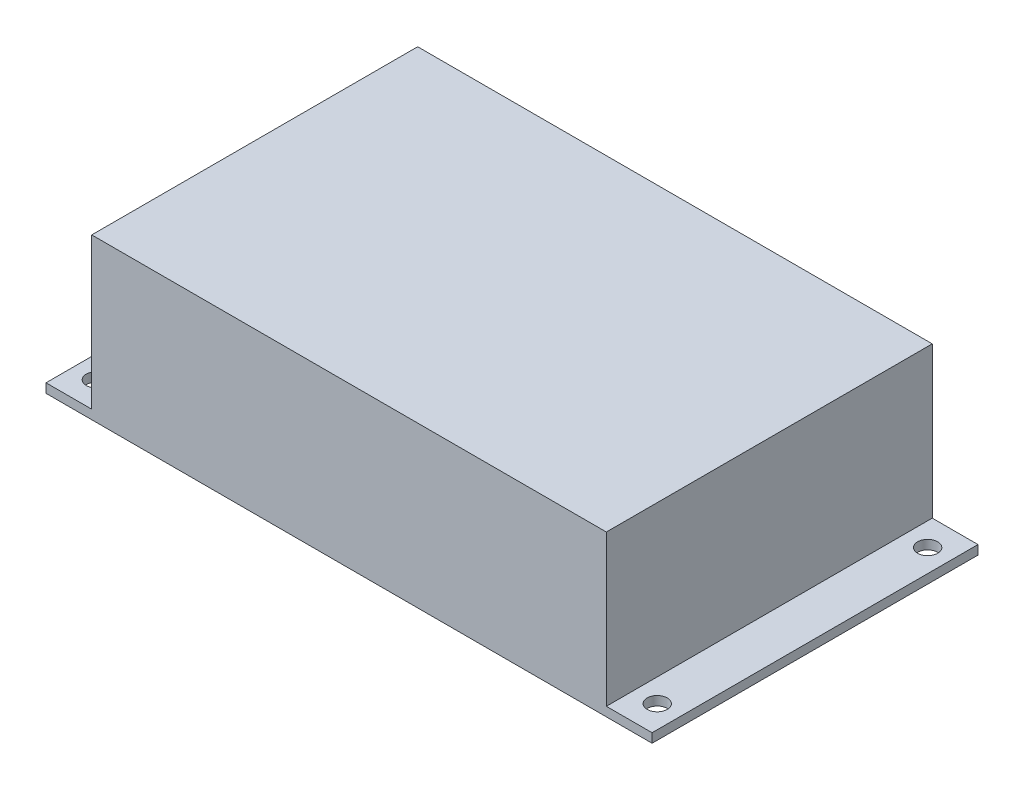
ISO-10303-21;
HEADER;
FILE_DESCRIPTION(('STEP AP214'),'2;1');
FILE_NAME('part.step','',(''),(''),'','','');
FILE_SCHEMA(('AUTOMOTIVE_DESIGN { 1 0 10303 214 1 1 1 1 }'));
ENDSEC;
DATA;
#1=APPLICATION_CONTEXT('core data for automotive mechanical design processes');
#2=APPLICATION_PROTOCOL_DEFINITION('international standard','automotive_design',2000,#1);
#3=PRODUCT_CONTEXT('',#1,'mechanical');
#4=PRODUCT('Part','Part','',(#3));
#5=PRODUCT_RELATED_PRODUCT_CATEGORY('part','',(#4));
#6=PRODUCT_DEFINITION_FORMATION('','',#4);
#7=PRODUCT_DEFINITION_CONTEXT('part definition',#1,'design');
#8=PRODUCT_DEFINITION('design','',#6,#7);
#9=PRODUCT_DEFINITION_SHAPE('','',#8);
#10=(LENGTH_UNIT() NAMED_UNIT(*) SI_UNIT(.MILLI.,.METRE.));
#11=(NAMED_UNIT(*) PLANE_ANGLE_UNIT() SI_UNIT($,.RADIAN.));
#12=(NAMED_UNIT(*) SI_UNIT($,.STERADIAN.) SOLID_ANGLE_UNIT());
#13=UNCERTAINTY_MEASURE_WITH_UNIT(LENGTH_MEASURE(1.E-05),#10,'distance_accuracy_value','');
#14=(GEOMETRIC_REPRESENTATION_CONTEXT(3) GLOBAL_UNCERTAINTY_ASSIGNED_CONTEXT((#13)) GLOBAL_UNIT_ASSIGNED_CONTEXT((#10,
#11,#12)) REPRESENTATION_CONTEXT('',''));
#15=CARTESIAN_POINT('',(0.,0.,0.));
#16=DIRECTION('',(0.,0.,1.));
#17=DIRECTION('',(1.,0.,0.));
#18=AXIS2_PLACEMENT_3D('',#15,#16,#17);
#19=CARTESIAN_POINT('',(0.,1.6,0.));
#20=DIRECTION('',(0.,1.,0.));
#21=DIRECTION('',(0.,0.,1.));
#22=AXIS2_PLACEMENT_3D('',#19,#20,#21);
#23=PLANE('',#22);
#24=DIRECTION('',(0.,0.,1.));
#25=VECTOR('',#24,1.);
#26=CARTESIAN_POINT('',(-45.,1.6,-28.5));
#27=LINE('',#26,#25);
#28=CARTESIAN_POINT('',(-45.,1.6,-28.5));
#29=VERTEX_POINT('',#28);
#30=CARTESIAN_POINT('',(-45.,1.6,28.5));
#31=VERTEX_POINT('',#30);
#32=EDGE_CURVE('E52',#29,#31,#27,.T.);
#33=ORIENTED_EDGE('',*,*,#32,.F.);
#34=DIRECTION('',(-1.,0.,0.));
#35=VECTOR('',#34,1.);
#36=CARTESIAN_POINT('',(-53.,1.6,-28.5));
#37=LINE('',#36,#35);
#38=CARTESIAN_POINT('',(-53.,1.6,-28.5));
#39=VERTEX_POINT('',#38);
#40=EDGE_CURVE('E189',#29,#39,#37,.T.);
#41=ORIENTED_EDGE('',*,*,#40,.T.);
#42=DIRECTION('',(0.,0.,1.));
#43=VECTOR('',#42,1.);
#44=CARTESIAN_POINT('',(-53.,1.6,-28.5));
#45=LINE('',#44,#43);
#46=CARTESIAN_POINT('',(-53.,1.6,28.5));
#47=VERTEX_POINT('',#46);
#48=EDGE_CURVE('E156',#39,#47,#45,.T.);
#49=ORIENTED_EDGE('',*,*,#48,.T.);
#50=DIRECTION('',(1.,0.,0.));
#51=VECTOR('',#50,1.);
#52=CARTESIAN_POINT('',(-53.,1.6,28.5));
#53=LINE('',#52,#51);
#54=EDGE_CURVE('E169',#47,#31,#53,.T.);
#55=ORIENTED_EDGE('',*,*,#54,.T.);
#56=EDGE_LOOP('',(#33,#41,#49,#55));
#57=FACE_BOUND('',#56,.T.);
#58=CARTESIAN_POINT('',(-49.05,1.6,-23.65));
#59=DIRECTION('',(0.,1.,0.));
#60=DIRECTION('',(0.,0.,1.));
#61=AXIS2_PLACEMENT_3D('',#58,#59,#60);
#62=CIRCLE('',#61,1.75);
#63=CARTESIAN_POINT('',(-49.05,1.6,-21.9));
#64=VERTEX_POINT('',#63);
#65=EDGE_CURVE('E147',#64,#64,#62,.T.);
#66=ORIENTED_EDGE('',*,*,#65,.F.);
#67=EDGE_LOOP('',(#66));
#68=FACE_BOUND('',#67,.T.);
#69=CARTESIAN_POINT('',(-49.05,1.6,23.65));
#70=DIRECTION('',(0.,1.,0.));
#71=DIRECTION('',(0.,0.,-1.));
#72=AXIS2_PLACEMENT_3D('',#69,#70,#71);
#73=CIRCLE('',#72,1.75);
#74=CARTESIAN_POINT('',(-49.05,1.6,21.9));
#75=VERTEX_POINT('',#74);
#76=EDGE_CURVE('E141',#75,#75,#73,.T.);
#77=ORIENTED_EDGE('',*,*,#76,.F.);
#78=EDGE_LOOP('',(#77));
#79=FACE_BOUND('',#78,.T.);
#80=ADVANCED_FACE('F35',(#57,#68,#79),#23,.T.);
#81=CARTESIAN_POINT('',(-53.,1.6,-28.5));
#82=DIRECTION('',(1.,0.,0.));
#83=DIRECTION('',(0.,0.,-1.));
#84=AXIS2_PLACEMENT_3D('',#81,#82,#83);
#85=PLANE('',#84);
#86=DIRECTION('',(0.,0.,1.));
#87=VECTOR('',#86,1.);
#88=CARTESIAN_POINT('',(-53.,0.,-28.5));
#89=LINE('',#88,#87);
#90=CARTESIAN_POINT('',(-53.,0.,-28.5));
#91=VERTEX_POINT('',#90);
#92=CARTESIAN_POINT('',(-53.,0.,28.5));
#93=VERTEX_POINT('',#92);
#94=EDGE_CURVE('E153',#91,#93,#89,.T.);
#95=ORIENTED_EDGE('',*,*,#94,.T.);
#96=DIRECTION('',(0.,-1.,0.));
#97=VECTOR('',#96,1.);
#98=CARTESIAN_POINT('',(-53.,1.6,28.5));
#99=LINE('',#98,#97);
#100=EDGE_CURVE('E12',#47,#93,#99,.T.);
#101=ORIENTED_EDGE('',*,*,#100,.F.);
#102=ORIENTED_EDGE('',*,*,#48,.F.);
#103=DIRECTION('',(0.,-1.,0.));
#104=VECTOR('',#103,1.);
#105=CARTESIAN_POINT('',(-53.,1.6,-28.5));
#106=LINE('',#105,#104);
#107=EDGE_CURVE('E176',#39,#91,#106,.T.);
#108=ORIENTED_EDGE('',*,*,#107,.T.);
#109=EDGE_LOOP('',(#95,#101,#102,#108));
#110=FACE_BOUND('',#109,.T.);
#111=ADVANCED_FACE('F37',(#110),#85,.F.);
#112=CARTESIAN_POINT('',(-53.,1.6,28.5));
#113=DIRECTION('',(0.,0.,-1.));
#114=DIRECTION('',(-1.,0.,0.));
#115=AXIS2_PLACEMENT_3D('',#112,#113,#114);
#116=PLANE('',#115);
#117=DIRECTION('',(1.,0.,0.));
#118=VECTOR('',#117,1.);
#119=CARTESIAN_POINT('',(-53.,0.,28.5));
#120=LINE('',#119,#118);
#121=CARTESIAN_POINT('',(53.,0.,28.5));
#122=VERTEX_POINT('',#121);
#123=EDGE_CURVE('E183',#93,#122,#120,.T.);
#124=ORIENTED_EDGE('',*,*,#123,.T.);
#125=DIRECTION('',(0.,-1.,0.));
#126=VECTOR('',#125,1.);
#127=CARTESIAN_POINT('',(53.,1.6,28.5));
#128=LINE('',#127,#126);
#129=CARTESIAN_POINT('',(53.,1.6,28.5));
#130=VERTEX_POINT('',#129);
#131=EDGE_CURVE('E44',#130,#122,#128,.T.);
#132=ORIENTED_EDGE('',*,*,#131,.F.);
#133=CARTESIAN_POINT('',(45.,1.6,28.5));
#134=VERTEX_POINT('',#133);
#135=EDGE_CURVE('E159',#134,#130,#53,.T.);
#136=ORIENTED_EDGE('',*,*,#135,.F.);
#137=DIRECTION('',(0.,-1.,0.));
#138=VECTOR('',#137,1.);
#139=CARTESIAN_POINT('',(45.,162.531685427388,28.5));
#140=LINE('',#139,#138);
#141=CARTESIAN_POINT('',(45.,28.,28.5));
#142=VERTEX_POINT('',#141);
#143=EDGE_CURVE('E216',#142,#134,#140,.T.);
#144=ORIENTED_EDGE('',*,*,#143,.F.);
#145=DIRECTION('',(1.,0.,0.));
#146=VECTOR('',#145,1.);
#147=CARTESIAN_POINT('',(-45.,28.,28.5));
#148=LINE('',#147,#146);
#149=CARTESIAN_POINT('',(-45.,28.,28.5));
#150=VERTEX_POINT('',#149);
#151=EDGE_CURVE('E123',#150,#142,#148,.T.);
#152=ORIENTED_EDGE('',*,*,#151,.F.);
#153=DIRECTION('',(0.,-1.,0.));
#154=VECTOR('',#153,1.);
#155=CARTESIAN_POINT('',(-45.,162.531685427388,28.5));
#156=LINE('',#155,#154);
#157=EDGE_CURVE('E209',#150,#31,#156,.T.);
#158=ORIENTED_EDGE('',*,*,#157,.T.);
#159=ORIENTED_EDGE('',*,*,#54,.F.);
#160=ORIENTED_EDGE('',*,*,#100,.T.);
#161=EDGE_LOOP('',(#124,#132,#136,#144,#152,#158,#159,#160));
#162=FACE_BOUND('',#161,.T.);
#163=ADVANCED_FACE('F224',(#162),#116,.F.);
#164=CARTESIAN_POINT('',(53.,1.6,-28.5));
#165=DIRECTION('',(-1.,0.,0.));
#166=DIRECTION('',(0.,0.,1.));
#167=AXIS2_PLACEMENT_3D('',#164,#165,#166);
#168=PLANE('',#167);
#169=DIRECTION('',(0.,0.,-1.));
#170=VECTOR('',#169,1.);
#171=CARTESIAN_POINT('',(53.,0.,-28.5));
#172=LINE('',#171,#170);
#173=CARTESIAN_POINT('',(53.,0.,-28.5));
#174=VERTEX_POINT('',#173);
#175=EDGE_CURVE('E181',#122,#174,#172,.T.);
#176=ORIENTED_EDGE('',*,*,#175,.T.);
#177=DIRECTION('',(0.,-1.,0.));
#178=VECTOR('',#177,1.);
#179=CARTESIAN_POINT('',(53.,1.6,-28.5));
#180=LINE('',#179,#178);
#181=CARTESIAN_POINT('',(53.,1.6,-28.5));
#182=VERTEX_POINT('',#181);
#183=EDGE_CURVE('E173',#182,#174,#180,.T.);
#184=ORIENTED_EDGE('',*,*,#183,.F.);
#185=DIRECTION('',(0.,0.,-1.));
#186=VECTOR('',#185,1.);
#187=CARTESIAN_POINT('',(53.,1.6,-28.5));
#188=LINE('',#187,#186);
#189=EDGE_CURVE('E163',#130,#182,#188,.T.);
#190=ORIENTED_EDGE('',*,*,#189,.F.);
#191=ORIENTED_EDGE('',*,*,#131,.T.);
#192=EDGE_LOOP('',(#176,#184,#190,#191));
#193=FACE_BOUND('',#192,.T.);
#194=ADVANCED_FACE('F197',(#193),#168,.F.);
#195=CARTESIAN_POINT('',(-53.,1.6,-28.5));
#196=DIRECTION('',(0.,0.,1.));
#197=DIRECTION('',(1.,0.,0.));
#198=AXIS2_PLACEMENT_3D('',#195,#196,#197);
#199=PLANE('',#198);
#200=DIRECTION('',(-1.,0.,0.));
#201=VECTOR('',#200,1.);
#202=CARTESIAN_POINT('',(-53.,0.,-28.5));
#203=LINE('',#202,#201);
#204=EDGE_CURVE('E160',#174,#91,#203,.T.);
#205=ORIENTED_EDGE('',*,*,#204,.T.);
#206=ORIENTED_EDGE('',*,*,#107,.F.);
#207=ORIENTED_EDGE('',*,*,#40,.F.);
#208=DIRECTION('',(0.,-1.,0.));
#209=VECTOR('',#208,1.);
#210=CARTESIAN_POINT('',(-45.,162.531685427388,-28.5));
#211=LINE('',#210,#209);
#212=CARTESIAN_POINT('',(-45.,28.,-28.5));
#213=VERTEX_POINT('',#212);
#214=EDGE_CURVE('E115',#213,#29,#211,.T.);
#215=ORIENTED_EDGE('',*,*,#214,.F.);
#216=DIRECTION('',(-1.,0.,0.));
#217=VECTOR('',#216,1.);
#218=CARTESIAN_POINT('',(-45.,28.,-28.5));
#219=LINE('',#218,#217);
#220=CARTESIAN_POINT('',(45.,28.,-28.5));
#221=VERTEX_POINT('',#220);
#222=EDGE_CURVE('E110',#221,#213,#219,.T.);
#223=ORIENTED_EDGE('',*,*,#222,.F.);
#224=DIRECTION('',(0.,-1.,0.));
#225=VECTOR('',#224,1.);
#226=CARTESIAN_POINT('',(45.,162.531685427388,-28.5));
#227=LINE('',#226,#225);
#228=CARTESIAN_POINT('',(45.,1.6,-28.5));
#229=VERTEX_POINT('',#228);
#230=EDGE_CURVE('E101',#221,#229,#227,.T.);
#231=ORIENTED_EDGE('',*,*,#230,.T.);
#232=EDGE_CURVE('E179',#182,#229,#37,.T.);
#233=ORIENTED_EDGE('',*,*,#232,.F.);
#234=ORIENTED_EDGE('',*,*,#183,.T.);
#235=EDGE_LOOP('',(#205,#206,#207,#215,#223,#231,#233,#234));
#236=FACE_BOUND('',#235,.T.);
#237=ADVANCED_FACE('F113',(#236),#199,.F.);
#238=DIRECTION('',(0.,0.,-1.));
#239=VECTOR('',#238,1.);
#240=CARTESIAN_POINT('',(45.,1.6,-28.5));
#241=LINE('',#240,#239);
#242=EDGE_CURVE('E60',#134,#229,#241,.T.);
#243=ORIENTED_EDGE('',*,*,#242,.F.);
#244=ORIENTED_EDGE('',*,*,#135,.T.);
#245=ORIENTED_EDGE('',*,*,#189,.T.);
#246=ORIENTED_EDGE('',*,*,#232,.T.);
#247=EDGE_LOOP('',(#243,#244,#245,#246));
#248=FACE_BOUND('',#247,.T.);
#249=CARTESIAN_POINT('',(49.05,1.6,-23.65));
#250=DIRECTION('',(0.,1.,0.));
#251=DIRECTION('',(0.,0.,-1.));
#252=AXIS2_PLACEMENT_3D('',#249,#250,#251);
#253=CIRCLE('',#252,1.75);
#254=CARTESIAN_POINT('',(49.05,1.6,-25.4));
#255=VERTEX_POINT('',#254);
#256=EDGE_CURVE('E124',#255,#255,#253,.T.);
#257=ORIENTED_EDGE('',*,*,#256,.F.);
#258=EDGE_LOOP('',(#257));
#259=FACE_BOUND('',#258,.T.);
#260=CARTESIAN_POINT('',(49.05,1.6,23.65));
#261=DIRECTION('',(0.,1.,0.));
#262=DIRECTION('',(0.,0.,1.));
#263=AXIS2_PLACEMENT_3D('',#260,#261,#262);
#264=CIRCLE('',#263,1.75);
#265=CARTESIAN_POINT('',(49.05,1.6,25.4));
#266=VERTEX_POINT('',#265);
#267=EDGE_CURVE('E136',#266,#266,#264,.T.);
#268=ORIENTED_EDGE('',*,*,#267,.F.);
#269=EDGE_LOOP('',(#268));
#270=FACE_BOUND('',#269,.T.);
#271=ADVANCED_FACE('F193',(#248,#259,#270),#23,.T.);
#272=CARTESIAN_POINT('',(0.,0.,0.));
#273=DIRECTION('',(0.,1.,0.));
#274=DIRECTION('',(0.,0.,1.));
#275=AXIS2_PLACEMENT_3D('',#272,#273,#274);
#276=PLANE('',#275);
#277=CARTESIAN_POINT('',(49.05,0.,-23.65));
#278=DIRECTION('',(0.,1.,0.));
#279=DIRECTION('',(0.,0.,-1.));
#280=AXIS2_PLACEMENT_3D('',#277,#278,#279);
#281=CIRCLE('',#280,1.75);
#282=CARTESIAN_POINT('',(49.05,0.,-25.4));
#283=VERTEX_POINT('',#282);
#284=EDGE_CURVE('E127',#283,#283,#281,.T.);
#285=ORIENTED_EDGE('',*,*,#284,.T.);
#286=EDGE_LOOP('',(#285));
#287=FACE_BOUND('',#286,.T.);
#288=CARTESIAN_POINT('',(49.05,0.,23.65));
#289=DIRECTION('',(0.,1.,0.));
#290=DIRECTION('',(0.,0.,1.));
#291=AXIS2_PLACEMENT_3D('',#288,#289,#290);
#292=CIRCLE('',#291,1.75);
#293=CARTESIAN_POINT('',(49.05,0.,25.4));
#294=VERTEX_POINT('',#293);
#295=EDGE_CURVE('E138',#294,#294,#292,.T.);
#296=ORIENTED_EDGE('',*,*,#295,.T.);
#297=EDGE_LOOP('',(#296));
#298=FACE_BOUND('',#297,.T.);
#299=CARTESIAN_POINT('',(-49.05,0.,23.65));
#300=DIRECTION('',(0.,1.,0.));
#301=DIRECTION('',(0.,0.,-1.));
#302=AXIS2_PLACEMENT_3D('',#299,#300,#301);
#303=CIRCLE('',#302,1.75);
#304=CARTESIAN_POINT('',(-49.05,0.,21.9));
#305=VERTEX_POINT('',#304);
#306=EDGE_CURVE('E144',#305,#305,#303,.T.);
#307=ORIENTED_EDGE('',*,*,#306,.T.);
#308=EDGE_LOOP('',(#307));
#309=FACE_BOUND('',#308,.T.);
#310=CARTESIAN_POINT('',(-49.05,0.,-23.65));
#311=DIRECTION('',(0.,1.,0.));
#312=DIRECTION('',(0.,0.,1.));
#313=AXIS2_PLACEMENT_3D('',#310,#311,#312);
#314=CIRCLE('',#313,1.75);
#315=CARTESIAN_POINT('',(-49.05,0.,-21.9));
#316=VERTEX_POINT('',#315);
#317=EDGE_CURVE('E150',#316,#316,#314,.T.);
#318=ORIENTED_EDGE('',*,*,#317,.T.);
#319=EDGE_LOOP('',(#318));
#320=FACE_BOUND('',#319,.T.);
#321=ORIENTED_EDGE('',*,*,#94,.F.);
#322=ORIENTED_EDGE('',*,*,#204,.F.);
#323=ORIENTED_EDGE('',*,*,#175,.F.);
#324=ORIENTED_EDGE('',*,*,#123,.F.);
#325=EDGE_LOOP('',(#321,#322,#323,#324));
#326=FACE_BOUND('',#325,.T.);
#327=ADVANCED_FACE('F202',(#287,#298,#309,#320,#326),#276,.F.);
#328=CARTESIAN_POINT('',(-49.05,0.,-23.65));
#329=DIRECTION('',(0.,1.,0.));
#330=DIRECTION('',(0.,0.,1.));
#331=AXIS2_PLACEMENT_3D('',#328,#329,#330);
#332=CYLINDRICAL_SURFACE('',#331,1.75);
#333=ORIENTED_EDGE('',*,*,#317,.F.);
#334=EDGE_LOOP('',(#333));
#335=FACE_BOUND('',#334,.T.);
#336=ORIENTED_EDGE('',*,*,#65,.T.);
#337=EDGE_LOOP('',(#336));
#338=FACE_BOUND('',#337,.T.);
#339=ADVANCED_FACE('F235',(#335,#338),#332,.F.);
#340=CARTESIAN_POINT('',(-49.05,0.,23.65));
#341=DIRECTION('',(0.,1.,0.));
#342=DIRECTION('',(0.,0.,1.));
#343=AXIS2_PLACEMENT_3D('',#340,#341,#342);
#344=CYLINDRICAL_SURFACE('',#343,1.75);
#345=ORIENTED_EDGE('',*,*,#306,.F.);
#346=EDGE_LOOP('',(#345));
#347=FACE_BOUND('',#346,.T.);
#348=ORIENTED_EDGE('',*,*,#76,.T.);
#349=EDGE_LOOP('',(#348));
#350=FACE_BOUND('',#349,.T.);
#351=ADVANCED_FACE('F232',(#347,#350),#344,.F.);
#352=CARTESIAN_POINT('',(49.05,0.,23.65));
#353=DIRECTION('',(0.,1.,0.));
#354=DIRECTION('',(0.,0.,1.));
#355=AXIS2_PLACEMENT_3D('',#352,#353,#354);
#356=CYLINDRICAL_SURFACE('',#355,1.75);
#357=ORIENTED_EDGE('',*,*,#295,.F.);
#358=EDGE_LOOP('',(#357));
#359=FACE_BOUND('',#358,.T.);
#360=ORIENTED_EDGE('',*,*,#267,.T.);
#361=EDGE_LOOP('',(#360));
#362=FACE_BOUND('',#361,.T.);
#363=ADVANCED_FACE('F234',(#359,#362),#356,.F.);
#364=CARTESIAN_POINT('',(49.05,0.,-23.65));
#365=DIRECTION('',(0.,1.,0.));
#366=DIRECTION('',(0.,0.,1.));
#367=AXIS2_PLACEMENT_3D('',#364,#365,#366);
#368=CYLINDRICAL_SURFACE('',#367,1.75);
#369=ORIENTED_EDGE('',*,*,#284,.F.);
#370=EDGE_LOOP('',(#369));
#371=FACE_BOUND('',#370,.T.);
#372=ORIENTED_EDGE('',*,*,#256,.T.);
#373=EDGE_LOOP('',(#372));
#374=FACE_BOUND('',#373,.T.);
#375=ADVANCED_FACE('F242',(#371,#374),#368,.F.);
#376=CARTESIAN_POINT('',(-45.,162.531685427388,-28.5));
#377=DIRECTION('',(1.,0.,0.));
#378=DIRECTION('',(0.,0.,-1.));
#379=AXIS2_PLACEMENT_3D('',#376,#377,#378);
#380=PLANE('',#379);
#381=DIRECTION('',(0.,0.,1.));
#382=VECTOR('',#381,1.);
#383=CARTESIAN_POINT('',(-45.,28.,-28.5));
#384=LINE('',#383,#382);
#385=EDGE_CURVE('E119',#213,#150,#384,.T.);
#386=ORIENTED_EDGE('',*,*,#385,.F.);
#387=ORIENTED_EDGE('',*,*,#214,.T.);
#388=ORIENTED_EDGE('',*,*,#32,.T.);
#389=ORIENTED_EDGE('',*,*,#157,.F.);
#390=EDGE_LOOP('',(#386,#387,#388,#389));
#391=FACE_BOUND('',#390,.T.);
#392=ADVANCED_FACE('F207',(#391),#380,.F.);
#393=CARTESIAN_POINT('',(45.,162.531685427388,-28.5));
#394=DIRECTION('',(-1.,0.,0.));
#395=DIRECTION('',(0.,0.,1.));
#396=AXIS2_PLACEMENT_3D('',#393,#394,#395);
#397=PLANE('',#396);
#398=DIRECTION('',(0.,0.,-1.));
#399=VECTOR('',#398,1.);
#400=CARTESIAN_POINT('',(45.,28.,-28.5));
#401=LINE('',#400,#399);
#402=EDGE_CURVE('E106',#142,#221,#401,.T.);
#403=ORIENTED_EDGE('',*,*,#402,.F.);
#404=ORIENTED_EDGE('',*,*,#143,.T.);
#405=ORIENTED_EDGE('',*,*,#242,.T.);
#406=ORIENTED_EDGE('',*,*,#230,.F.);
#407=EDGE_LOOP('',(#403,#404,#405,#406));
#408=FACE_BOUND('',#407,.T.);
#409=ADVANCED_FACE('F103',(#408),#397,.F.);
#410=CARTESIAN_POINT('',(0.,28.,0.));
#411=DIRECTION('',(0.,1.,0.));
#412=DIRECTION('',(0.,0.,1.));
#413=AXIS2_PLACEMENT_3D('',#410,#411,#412);
#414=PLANE('',#413);
#415=ORIENTED_EDGE('',*,*,#222,.T.);
#416=ORIENTED_EDGE('',*,*,#385,.T.);
#417=ORIENTED_EDGE('',*,*,#151,.T.);
#418=ORIENTED_EDGE('',*,*,#402,.T.);
#419=EDGE_LOOP('',(#415,#416,#417,#418));
#420=FACE_BOUND('',#419,.T.);
#421=ADVANCED_FACE('F122',(#420),#414,.T.);
#422=CLOSED_SHELL('',(#80,#111,#163,#194,#237,#271,#327,#339,#351,#363,#375,#392,#409,#421));
#423=MANIFOLD_SOLID_BREP('B2',#422);
#424=ADVANCED_BREP_SHAPE_REPRESENTATION('',(#18,#423),#14);
#425=SHAPE_DEFINITION_REPRESENTATION(#9,#424);
ENDSEC;
END-ISO-10303-21;
